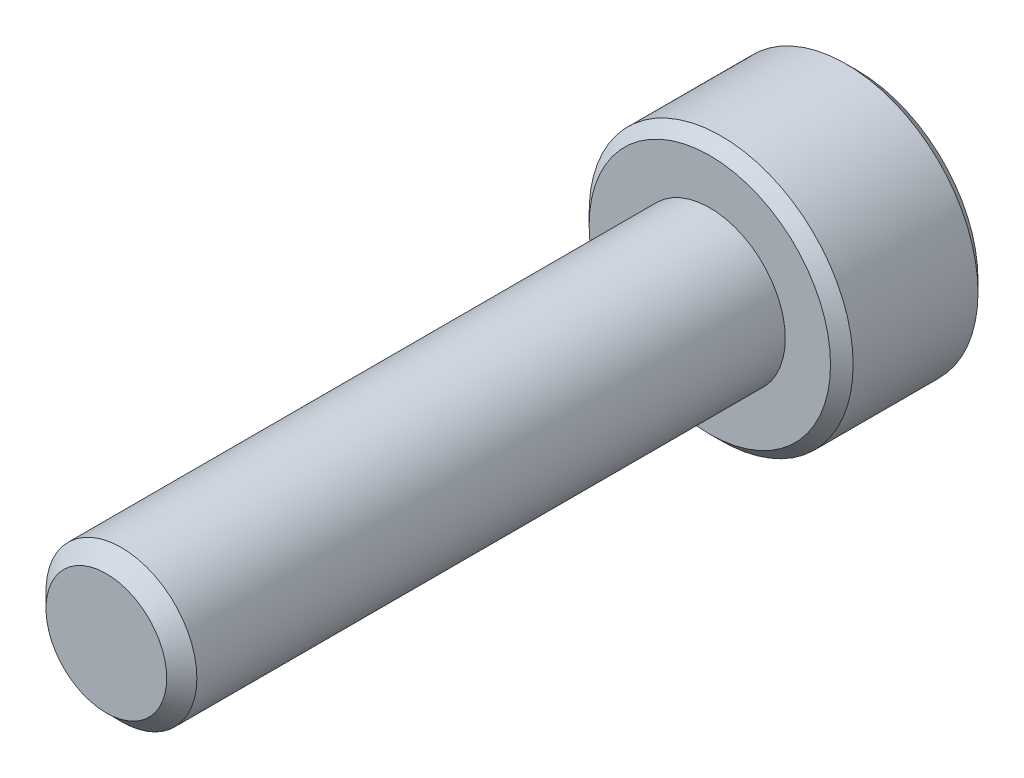
ISO-10303-21;
HEADER;
FILE_DESCRIPTION(('STEP AP214'),'2;1');
FILE_NAME('part.step','',(''),(''),'','','');
FILE_SCHEMA(('AUTOMOTIVE_DESIGN { 1 0 10303 214 1 1 1 1 }'));
ENDSEC;
DATA;
#1=APPLICATION_CONTEXT('core data for automotive mechanical design processes');
#2=APPLICATION_PROTOCOL_DEFINITION('international standard','automotive_design',2000,#1);
#3=PRODUCT_CONTEXT('',#1,'mechanical');
#4=PRODUCT('Part','Part','',(#3));
#5=PRODUCT_RELATED_PRODUCT_CATEGORY('part','',(#4));
#6=PRODUCT_DEFINITION_FORMATION('','',#4);
#7=PRODUCT_DEFINITION_CONTEXT('part definition',#1,'design');
#8=PRODUCT_DEFINITION('design','',#6,#7);
#9=PRODUCT_DEFINITION_SHAPE('','',#8);
#10=(LENGTH_UNIT() NAMED_UNIT(*) SI_UNIT(.MILLI.,.METRE.));
#11=(NAMED_UNIT(*) PLANE_ANGLE_UNIT() SI_UNIT($,.RADIAN.));
#12=(NAMED_UNIT(*) SI_UNIT($,.STERADIAN.) SOLID_ANGLE_UNIT());
#13=UNCERTAINTY_MEASURE_WITH_UNIT(LENGTH_MEASURE(1.E-05),#10,'distance_accuracy_value','');
#14=(GEOMETRIC_REPRESENTATION_CONTEXT(3) GLOBAL_UNCERTAINTY_ASSIGNED_CONTEXT((#13)) GLOBAL_UNIT_ASSIGNED_CONTEXT((#10,
#11,#12)) REPRESENTATION_CONTEXT('',''));
#15=CARTESIAN_POINT('',(0.,0.,0.));
#16=DIRECTION('',(0.,0.,1.));
#17=DIRECTION('',(1.,0.,0.));
#18=AXIS2_PLACEMENT_3D('',#15,#16,#17);
#19=CARTESIAN_POINT('',(0.,0.,3.91));
#20=DIRECTION('',(0.,0.,-1.));
#21=DIRECTION('',(-1.,0.,0.));
#22=AXIS2_PLACEMENT_3D('',#19,#20,#21);
#23=CYLINDRICAL_SURFACE('',#22,3.5);
#24=CARTESIAN_POINT('',(0.,0.,3.61));
#25=DIRECTION('',(0.,0.,1.));
#26=DIRECTION('',(1.,0.,0.));
#27=AXIS2_PLACEMENT_3D('',#24,#25,#26);
#28=CIRCLE('',#27,3.5);
#29=CARTESIAN_POINT('',(3.5,0.,3.61));
#30=VERTEX_POINT('',#29);
#31=EDGE_CURVE('E47',#30,#30,#28,.F.);
#32=ORIENTED_EDGE('',*,*,#31,.T.);
#33=EDGE_LOOP('',(#32));
#34=FACE_BOUND('',#33,.T.);
#35=CARTESIAN_POINT('',(0.,0.,0.299999999999999));
#36=DIRECTION('',(0.,0.,1.));
#37=DIRECTION('',(1.,0.,0.));
#38=AXIS2_PLACEMENT_3D('',#35,#36,#37);
#39=CIRCLE('',#38,3.5);
#40=CARTESIAN_POINT('',(3.5,0.,0.299999999999999));
#41=VERTEX_POINT('',#40);
#42=EDGE_CURVE('E158',#41,#41,#39,.T.);
#43=ORIENTED_EDGE('',*,*,#42,.T.);
#44=EDGE_LOOP('',(#43));
#45=FACE_BOUND('',#44,.T.);
#46=ADVANCED_FACE('F38',(#34,#45),#23,.T.);
#47=CARTESIAN_POINT('',(0.,0.,3.91));
#48=DIRECTION('',(0.,0.,1.));
#49=DIRECTION('',(1.,0.,0.));
#50=AXIS2_PLACEMENT_3D('',#47,#48,#49);
#51=PLANE('',#50);
#52=CARTESIAN_POINT('',(0.,0.,3.91));
#53=DIRECTION('',(0.,0.,1.));
#54=DIRECTION('',(1.,0.,0.));
#55=AXIS2_PLACEMENT_3D('',#52,#53,#54);
#56=CIRCLE('',#55,3.2);
#57=CARTESIAN_POINT('',(3.2,0.,3.91));
#58=VERTEX_POINT('',#57);
#59=EDGE_CURVE('E155',#58,#58,#56,.T.);
#60=ORIENTED_EDGE('',*,*,#59,.T.);
#61=EDGE_LOOP('',(#60));
#62=FACE_BOUND('',#61,.T.);
#63=CARTESIAN_POINT('',(0.,0.,3.91));
#64=DIRECTION('',(0.,0.,1.));
#65=DIRECTION('',(1.,0.,0.));
#66=AXIS2_PLACEMENT_3D('',#63,#64,#65);
#67=CIRCLE('',#66,2.);
#68=CARTESIAN_POINT('',(2.,0.,3.91));
#69=VERTEX_POINT('',#68);
#70=EDGE_CURVE('E141',#69,#69,#67,.T.);
#71=ORIENTED_EDGE('',*,*,#70,.F.);
#72=EDGE_LOOP('',(#71));
#73=FACE_BOUND('',#72,.T.);
#74=ADVANCED_FACE('F171',(#62,#73),#51,.T.);
#75=CARTESIAN_POINT('',(0.,0.,0.));
#76=DIRECTION('',(0.,0.,1.));
#77=DIRECTION('',(1.,0.,0.));
#78=AXIS2_PLACEMENT_3D('',#75,#76,#77);
#79=PLANE('',#78);
#80=CARTESIAN_POINT('',(0.,0.,0.));
#81=DIRECTION('',(0.,0.,1.));
#82=DIRECTION('',(1.,0.,0.));
#83=AXIS2_PLACEMENT_3D('',#80,#81,#82);
#84=CIRCLE('',#83,3.2);
#85=CARTESIAN_POINT('',(3.2,0.,0.));
#86=VERTEX_POINT('',#85);
#87=EDGE_CURVE('E11',#86,#86,#84,.F.);
#88=ORIENTED_EDGE('',*,*,#87,.T.);
#89=EDGE_LOOP('',(#88));
#90=FACE_BOUND('',#89,.T.);
#91=DIRECTION('',(0.866025403784439,-0.5,0.));
#92=VECTOR('',#91,1.);
#93=CARTESIAN_POINT('',(0.,1.76091832102836,0.));
#94=LINE('',#93,#92);
#95=CARTESIAN_POINT('',(0.,1.76091832102836,0.));
#96=VERTEX_POINT('',#95);
#97=CARTESIAN_POINT('',(1.525,0.88045916051418,0.));
#98=VERTEX_POINT('',#97);
#99=EDGE_CURVE('E128',#96,#98,#94,.T.);
#100=ORIENTED_EDGE('',*,*,#99,.F.);
#101=DIRECTION('',(0.866025403784439,0.5,0.));
#102=VECTOR('',#101,1.);
#103=CARTESIAN_POINT('',(-1.525,0.880459160514179,0.));
#104=LINE('',#103,#102);
#105=CARTESIAN_POINT('',(-1.525,0.880459160514179,0.));
#106=VERTEX_POINT('',#105);
#107=EDGE_CURVE('E54',#106,#96,#104,.T.);
#108=ORIENTED_EDGE('',*,*,#107,.F.);
#109=DIRECTION('',(0.,1.,0.));
#110=VECTOR('',#109,1.);
#111=CARTESIAN_POINT('',(-1.525,-0.88045916051418,0.));
#112=LINE('',#111,#110);
#113=CARTESIAN_POINT('',(-1.525,-0.88045916051418,0.));
#114=VERTEX_POINT('',#113);
#115=EDGE_CURVE('E137',#114,#106,#112,.T.);
#116=ORIENTED_EDGE('',*,*,#115,.F.);
#117=DIRECTION('',(-0.866025403784439,0.5,0.));
#118=VECTOR('',#117,1.);
#119=CARTESIAN_POINT('',(0.,-1.76091832102836,0.));
#120=LINE('',#119,#118);
#121=CARTESIAN_POINT('',(0.,-1.76091832102836,0.));
#122=VERTEX_POINT('',#121);
#123=EDGE_CURVE('E135',#122,#114,#120,.T.);
#124=ORIENTED_EDGE('',*,*,#123,.F.);
#125=DIRECTION('',(-0.866025403784438,-0.5,0.));
#126=VECTOR('',#125,1.);
#127=CARTESIAN_POINT('',(1.525,-0.880459160514179,0.));
#128=LINE('',#127,#126);
#129=CARTESIAN_POINT('',(1.525,-0.880459160514179,0.));
#130=VERTEX_POINT('',#129);
#131=EDGE_CURVE('E102',#130,#122,#128,.T.);
#132=ORIENTED_EDGE('',*,*,#131,.F.);
#133=DIRECTION('',(0.,-1.,0.));
#134=VECTOR('',#133,1.);
#135=CARTESIAN_POINT('',(1.525,0.88045916051418,0.));
#136=LINE('',#135,#134);
#137=EDGE_CURVE('E131',#98,#130,#136,.T.);
#138=ORIENTED_EDGE('',*,*,#137,.F.);
#139=EDGE_LOOP('',(#100,#108,#116,#124,#132,#138));
#140=FACE_BOUND('',#139,.T.);
#141=ADVANCED_FACE('F174',(#90,#140),#79,.F.);
#142=CARTESIAN_POINT('',(0.,0.,19.91));
#143=DIRECTION('',(0.,0.,-1.));
#144=DIRECTION('',(-1.,0.,0.));
#145=AXIS2_PLACEMENT_3D('',#142,#143,#144);
#146=CYLINDRICAL_SURFACE('',#145,2.);
#147=CARTESIAN_POINT('',(0.,0.,19.51));
#148=DIRECTION('',(0.,0.,1.));
#149=DIRECTION('',(1.,0.,0.));
#150=AXIS2_PLACEMENT_3D('',#147,#148,#149);
#151=CIRCLE('',#150,2.);
#152=CARTESIAN_POINT('',(2.,0.,19.51));
#153=VERTEX_POINT('',#152);
#154=EDGE_CURVE('E152',#153,#153,#151,.F.);
#155=ORIENTED_EDGE('',*,*,#154,.T.);
#156=EDGE_LOOP('',(#155));
#157=FACE_BOUND('',#156,.T.);
#158=ORIENTED_EDGE('',*,*,#70,.T.);
#159=EDGE_LOOP('',(#158));
#160=FACE_BOUND('',#159,.T.);
#161=ADVANCED_FACE('F178',(#157,#160),#146,.T.);
#162=CARTESIAN_POINT('',(0.,0.,19.91));
#163=DIRECTION('',(0.,0.,1.));
#164=DIRECTION('',(1.,0.,0.));
#165=AXIS2_PLACEMENT_3D('',#162,#163,#164);
#166=PLANE('',#165);
#167=CARTESIAN_POINT('',(0.,0.,19.91));
#168=DIRECTION('',(0.,0.,1.));
#169=DIRECTION('',(1.,0.,0.));
#170=AXIS2_PLACEMENT_3D('',#167,#168,#169);
#171=CIRCLE('',#170,1.6);
#172=CARTESIAN_POINT('',(1.6,0.,19.91));
#173=VERTEX_POINT('',#172);
#174=EDGE_CURVE('E149',#173,#173,#171,.T.);
#175=ORIENTED_EDGE('',*,*,#174,.T.);
#176=EDGE_LOOP('',(#175));
#177=FACE_BOUND('',#176,.T.);
#178=ADVANCED_FACE('F180',(#177),#166,.T.);
#179=CARTESIAN_POINT('',(-1.525,0.880459160514179,2.));
#180=DIRECTION('',(-0.5,0.866025403784439,0.));
#181=DIRECTION('',(-0.866025403784439,-0.5,0.));
#182=AXIS2_PLACEMENT_3D('',#179,#180,#181);
#183=PLANE('',#182);
#184=ORIENTED_EDGE('',*,*,#107,.T.);
#185=DIRECTION('',(0.,0.,-1.));
#186=VECTOR('',#185,1.);
#187=CARTESIAN_POINT('',(0.,1.76091832102836,2.));
#188=LINE('',#187,#186);
#189=CARTESIAN_POINT('',(0.,1.76091832102836,2.));
#190=VERTEX_POINT('',#189);
#191=EDGE_CURVE('E84',#190,#96,#188,.T.);
#192=ORIENTED_EDGE('',*,*,#191,.F.);
#193=DIRECTION('',(0.866025403784439,0.5,0.));
#194=VECTOR('',#193,1.);
#195=CARTESIAN_POINT('',(-1.525,0.880459160514179,2.));
#196=LINE('',#195,#194);
#197=CARTESIAN_POINT('',(-1.525,0.880459160514179,2.));
#198=VERTEX_POINT('',#197);
#199=EDGE_CURVE('E139',#198,#190,#196,.T.);
#200=ORIENTED_EDGE('',*,*,#199,.F.);
#201=DIRECTION('',(0.,0.,-1.));
#202=VECTOR('',#201,1.);
#203=CARTESIAN_POINT('',(-1.525,0.880459160514179,2.));
#204=LINE('',#203,#202);
#205=EDGE_CURVE('E62',#198,#106,#204,.T.);
#206=ORIENTED_EDGE('',*,*,#205,.T.);
#207=EDGE_LOOP('',(#184,#192,#200,#206));
#208=FACE_BOUND('',#207,.T.);
#209=ADVANCED_FACE('F187',(#208),#183,.F.);
#210=CARTESIAN_POINT('',(-1.525,-0.88045916051418,2.));
#211=DIRECTION('',(-1.,0.,0.));
#212=DIRECTION('',(0.,0.,1.));
#213=AXIS2_PLACEMENT_3D('',#210,#211,#212);
#214=PLANE('',#213);
#215=ORIENTED_EDGE('',*,*,#115,.T.);
#216=ORIENTED_EDGE('',*,*,#205,.F.);
#217=DIRECTION('',(0.,1.,0.));
#218=VECTOR('',#217,1.);
#219=CARTESIAN_POINT('',(-1.525,-0.88045916051418,2.));
#220=LINE('',#219,#218);
#221=CARTESIAN_POINT('',(-1.525,-0.88045916051418,2.));
#222=VERTEX_POINT('',#221);
#223=EDGE_CURVE('E114',#222,#198,#220,.T.);
#224=ORIENTED_EDGE('',*,*,#223,.F.);
#225=DIRECTION('',(0.,0.,-1.));
#226=VECTOR('',#225,1.);
#227=CARTESIAN_POINT('',(-1.525,-0.88045916051418,2.));
#228=LINE('',#227,#226);
#229=EDGE_CURVE('E106',#222,#114,#228,.T.);
#230=ORIENTED_EDGE('',*,*,#229,.T.);
#231=EDGE_LOOP('',(#215,#216,#224,#230));
#232=FACE_BOUND('',#231,.T.);
#233=ADVANCED_FACE('F222',(#232),#214,.F.);
#234=CARTESIAN_POINT('',(0.,-1.76091832102836,2.));
#235=DIRECTION('',(-0.5,-0.866025403784439,0.));
#236=DIRECTION('',(0.866025403784439,-0.5,0.));
#237=AXIS2_PLACEMENT_3D('',#234,#235,#236);
#238=PLANE('',#237);
#239=ORIENTED_EDGE('',*,*,#123,.T.);
#240=ORIENTED_EDGE('',*,*,#229,.F.);
#241=DIRECTION('',(-0.866025403784439,0.5,0.));
#242=VECTOR('',#241,1.);
#243=CARTESIAN_POINT('',(0.,-1.76091832102836,2.));
#244=LINE('',#243,#242);
#245=CARTESIAN_POINT('',(0.,-1.76091832102836,2.));
#246=VERTEX_POINT('',#245);
#247=EDGE_CURVE('E110',#246,#222,#244,.T.);
#248=ORIENTED_EDGE('',*,*,#247,.F.);
#249=DIRECTION('',(0.,0.,-1.));
#250=VECTOR('',#249,1.);
#251=CARTESIAN_POINT('',(0.,-1.76091832102836,2.));
#252=LINE('',#251,#250);
#253=EDGE_CURVE('E95',#246,#122,#252,.T.);
#254=ORIENTED_EDGE('',*,*,#253,.T.);
#255=EDGE_LOOP('',(#239,#240,#248,#254));
#256=FACE_BOUND('',#255,.T.);
#257=ADVANCED_FACE('F111',(#256),#238,.F.);
#258=CARTESIAN_POINT('',(1.525,-0.880459160514179,2.));
#259=DIRECTION('',(0.5,-0.866025403784439,0.));
#260=DIRECTION('',(0.866025403784438,0.5,0.));
#261=AXIS2_PLACEMENT_3D('',#258,#259,#260);
#262=PLANE('',#261);
#263=ORIENTED_EDGE('',*,*,#131,.T.);
#264=ORIENTED_EDGE('',*,*,#253,.F.);
#265=DIRECTION('',(-0.866025403784438,-0.5,0.));
#266=VECTOR('',#265,1.);
#267=CARTESIAN_POINT('',(1.525,-0.880459160514179,2.));
#268=LINE('',#267,#266);
#269=CARTESIAN_POINT('',(1.525,-0.880459160514179,2.));
#270=VERTEX_POINT('',#269);
#271=EDGE_CURVE('E99',#270,#246,#268,.T.);
#272=ORIENTED_EDGE('',*,*,#271,.F.);
#273=DIRECTION('',(0.,0.,-1.));
#274=VECTOR('',#273,1.);
#275=CARTESIAN_POINT('',(1.525,-0.880459160514179,2.));
#276=LINE('',#275,#274);
#277=EDGE_CURVE('E107',#270,#130,#276,.T.);
#278=ORIENTED_EDGE('',*,*,#277,.T.);
#279=EDGE_LOOP('',(#263,#264,#272,#278));
#280=FACE_BOUND('',#279,.T.);
#281=ADVANCED_FACE('F97',(#280),#262,.F.);
#282=CARTESIAN_POINT('',(1.525,0.88045916051418,2.));
#283=DIRECTION('',(1.,0.,0.));
#284=DIRECTION('',(0.,0.,-1.));
#285=AXIS2_PLACEMENT_3D('',#282,#283,#284);
#286=PLANE('',#285);
#287=ORIENTED_EDGE('',*,*,#137,.T.);
#288=ORIENTED_EDGE('',*,*,#277,.F.);
#289=DIRECTION('',(0.,-1.,0.));
#290=VECTOR('',#289,1.);
#291=CARTESIAN_POINT('',(1.525,0.88045916051418,2.));
#292=LINE('',#291,#290);
#293=CARTESIAN_POINT('',(1.525,0.88045916051418,2.));
#294=VERTEX_POINT('',#293);
#295=EDGE_CURVE('E120',#294,#270,#292,.T.);
#296=ORIENTED_EDGE('',*,*,#295,.F.);
#297=DIRECTION('',(0.,0.,-1.));
#298=VECTOR('',#297,1.);
#299=CARTESIAN_POINT('',(1.525,0.88045916051418,2.));
#300=LINE('',#299,#298);
#301=EDGE_CURVE('E144',#294,#98,#300,.T.);
#302=ORIENTED_EDGE('',*,*,#301,.T.);
#303=EDGE_LOOP('',(#287,#288,#296,#302));
#304=FACE_BOUND('',#303,.T.);
#305=ADVANCED_FACE('F218',(#304),#286,.F.);
#306=CARTESIAN_POINT('',(0.,1.76091832102836,2.));
#307=DIRECTION('',(0.5,0.866025403784439,0.));
#308=DIRECTION('',(-0.866025403784439,0.5,0.));
#309=AXIS2_PLACEMENT_3D('',#306,#307,#308);
#310=PLANE('',#309);
#311=ORIENTED_EDGE('',*,*,#99,.T.);
#312=ORIENTED_EDGE('',*,*,#301,.F.);
#313=DIRECTION('',(0.866025403784439,-0.5,0.));
#314=VECTOR('',#313,1.);
#315=CARTESIAN_POINT('',(0.,1.76091832102836,2.));
#316=LINE('',#315,#314);
#317=EDGE_CURVE('E122',#190,#294,#316,.T.);
#318=ORIENTED_EDGE('',*,*,#317,.F.);
#319=ORIENTED_EDGE('',*,*,#191,.T.);
#320=EDGE_LOOP('',(#311,#312,#318,#319));
#321=FACE_BOUND('',#320,.T.);
#322=ADVANCED_FACE('F210',(#321),#310,.F.);
#323=CARTESIAN_POINT('',(0.,0.,2.));
#324=DIRECTION('',(0.,0.,-1.));
#325=DIRECTION('',(-1.,0.,0.));
#326=AXIS2_PLACEMENT_3D('',#323,#324,#325);
#327=PLANE('',#326);
#328=ORIENTED_EDGE('',*,*,#199,.T.);
#329=ORIENTED_EDGE('',*,*,#317,.T.);
#330=ORIENTED_EDGE('',*,*,#295,.T.);
#331=ORIENTED_EDGE('',*,*,#271,.T.);
#332=ORIENTED_EDGE('',*,*,#247,.T.);
#333=ORIENTED_EDGE('',*,*,#223,.T.);
#334=EDGE_LOOP('',(#328,#329,#330,#331,#332,#333));
#335=FACE_BOUND('',#334,.T.);
#336=ADVANCED_FACE('F117',(#335),#327,.T.);
#337=CARTESIAN_POINT('',(0.,0.,19.91));
#338=DIRECTION('',(0.,0.,-1.));
#339=DIRECTION('',(-1.,0.,0.));
#340=AXIS2_PLACEMENT_3D('',#337,#338,#339);
#341=CONICAL_SURFACE('',#340,1.6,0.785398163397446);
#342=ORIENTED_EDGE('',*,*,#154,.F.);
#343=EDGE_LOOP('',(#342));
#344=FACE_BOUND('',#343,.T.);
#345=ORIENTED_EDGE('',*,*,#174,.F.);
#346=EDGE_LOOP('',(#345));
#347=FACE_BOUND('',#346,.T.);
#348=ADVANCED_FACE('F168',(#344,#347),#341,.T.);
#349=CARTESIAN_POINT('',(0.,0.,3.91));
#350=DIRECTION('',(0.,0.,-1.));
#351=DIRECTION('',(-1.,0.,0.));
#352=AXIS2_PLACEMENT_3D('',#349,#350,#351);
#353=CONICAL_SURFACE('',#352,3.2,0.785398163397447);
#354=ORIENTED_EDGE('',*,*,#31,.F.);
#355=EDGE_LOOP('',(#354));
#356=FACE_BOUND('',#355,.T.);
#357=ORIENTED_EDGE('',*,*,#59,.F.);
#358=EDGE_LOOP('',(#357));
#359=FACE_BOUND('',#358,.T.);
#360=ADVANCED_FACE('F165',(#356,#359),#353,.T.);
#361=CARTESIAN_POINT('',(0.,0.,0.299999999999999));
#362=DIRECTION('',(0.,0.,1.));
#363=DIRECTION('',(1.,0.,0.));
#364=AXIS2_PLACEMENT_3D('',#361,#362,#363);
#365=CONICAL_SURFACE('',#364,3.5,0.785398163397448);
#366=ORIENTED_EDGE('',*,*,#87,.F.);
#367=EDGE_LOOP('',(#366));
#368=FACE_BOUND('',#367,.T.);
#369=ORIENTED_EDGE('',*,*,#42,.F.);
#370=EDGE_LOOP('',(#369));
#371=FACE_BOUND('',#370,.T.);
#372=ADVANCED_FACE('F41',(#368,#371),#365,.T.);
#373=CLOSED_SHELL('',(#46,#74,#141,#161,#178,#209,#233,#257,#281,#305,#322,#336,#348,#360,#372));
#374=MANIFOLD_SOLID_BREP('B2',#373);
#375=ADVANCED_BREP_SHAPE_REPRESENTATION('',(#18,#374),#14);
#376=SHAPE_DEFINITION_REPRESENTATION(#9,#375);
ENDSEC;
END-ISO-10303-21;
